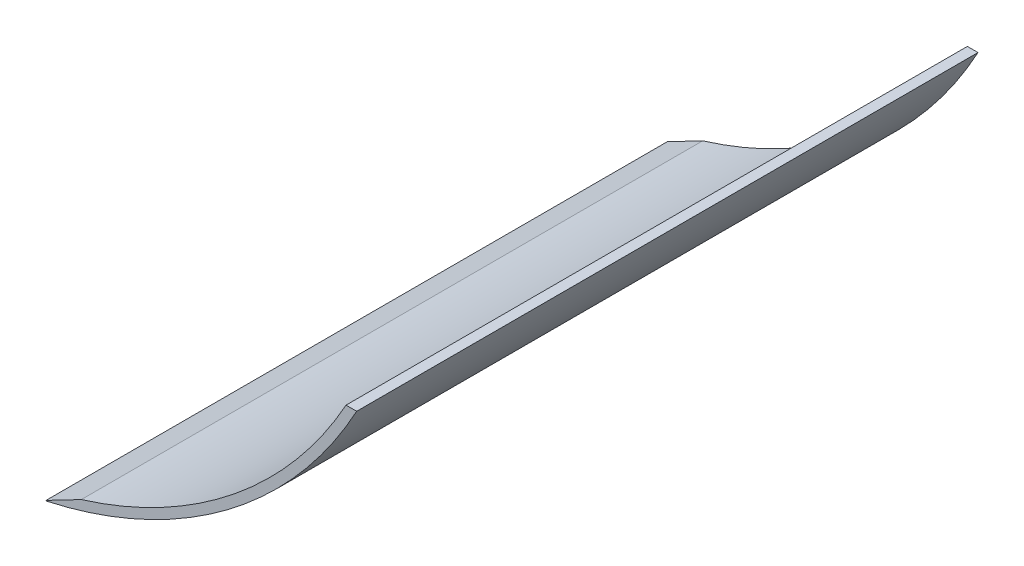
ISO-10303-21;
HEADER;
FILE_DESCRIPTION(('STEP AP214'),'2;1');
FILE_NAME('part.step','',(''),(''),'','','');
FILE_SCHEMA(('AUTOMOTIVE_DESIGN { 1 0 10303 214 1 1 1 1 }'));
ENDSEC;
DATA;
#1=APPLICATION_CONTEXT('core data for automotive mechanical design processes');
#2=APPLICATION_PROTOCOL_DEFINITION('international standard','automotive_design',2000,#1);
#3=PRODUCT_CONTEXT('',#1,'mechanical');
#4=PRODUCT('Part','Part','',(#3));
#5=PRODUCT_RELATED_PRODUCT_CATEGORY('part','',(#4));
#6=PRODUCT_DEFINITION_FORMATION('','',#4);
#7=PRODUCT_DEFINITION_CONTEXT('part definition',#1,'design');
#8=PRODUCT_DEFINITION('design','',#6,#7);
#9=PRODUCT_DEFINITION_SHAPE('','',#8);
#10=(LENGTH_UNIT() NAMED_UNIT(*) SI_UNIT(.MILLI.,.METRE.));
#11=(NAMED_UNIT(*) PLANE_ANGLE_UNIT() SI_UNIT($,.RADIAN.));
#12=(NAMED_UNIT(*) SI_UNIT($,.STERADIAN.) SOLID_ANGLE_UNIT());
#13=UNCERTAINTY_MEASURE_WITH_UNIT(LENGTH_MEASURE(1.E-05),#10,'distance_accuracy_value','');
#14=(GEOMETRIC_REPRESENTATION_CONTEXT(3) GLOBAL_UNCERTAINTY_ASSIGNED_CONTEXT((#13)) GLOBAL_UNIT_ASSIGNED_CONTEXT((#10,
#11,#12)) REPRESENTATION_CONTEXT('',''));
#15=CARTESIAN_POINT('',(0.,0.,0.));
#16=DIRECTION('',(0.,0.,1.));
#17=DIRECTION('',(1.,0.,0.));
#18=AXIS2_PLACEMENT_3D('',#15,#16,#17);
#19=CARTESIAN_POINT('',(-31.8153408597679,146.587121146357,200.));
#20=DIRECTION('',(0.,0.,-1.));
#21=DIRECTION('',(-1.,0.,0.));
#22=AXIS2_PLACEMENT_3D('',#19,#20,#21);
#23=CYLINDRICAL_SURFACE('',#22,150.);
#24=CARTESIAN_POINT('',(-31.8153408597679,146.587121146357,0.));
#25=DIRECTION('',(0.,0.,1.));
#26=DIRECTION('',(1.,0.,0.));
#27=AXIS2_PLACEMENT_3D('',#24,#25,#26);
#28=CIRCLE('',#27,150.);
#29=CARTESIAN_POINT('',(0.,0.,0.));
#30=VERTEX_POINT('',#29);
#31=CARTESIAN_POINT('',(100.,75.,0.));
#32=VERTEX_POINT('',#31);
#33=EDGE_CURVE('E114',#30,#32,#28,.T.);
#34=ORIENTED_EDGE('',*,*,#33,.T.);
#35=DIRECTION('',(0.,0.,-1.));
#36=VECTOR('',#35,1.);
#37=CARTESIAN_POINT('',(100.,75.,200.));
#38=LINE('',#37,#36);
#39=CARTESIAN_POINT('',(100.,75.,200.));
#40=VERTEX_POINT('',#39);
#41=EDGE_CURVE('E94',#40,#32,#38,.T.);
#42=ORIENTED_EDGE('',*,*,#41,.F.);
#43=CARTESIAN_POINT('',(-31.8153408597679,146.587121146357,200.));
#44=DIRECTION('',(0.,0.,1.));
#45=DIRECTION('',(1.,0.,0.));
#46=AXIS2_PLACEMENT_3D('',#43,#44,#45);
#47=CIRCLE('',#46,150.);
#48=CARTESIAN_POINT('',(0.,0.,200.));
#49=VERTEX_POINT('',#48);
#50=EDGE_CURVE('E101',#49,#40,#47,.T.);
#51=ORIENTED_EDGE('',*,*,#50,.F.);
#52=DIRECTION('',(0.,0.,-1.));
#53=VECTOR('',#52,1.);
#54=CARTESIAN_POINT('',(0.,0.,200.));
#55=LINE('',#54,#53);
#56=EDGE_CURVE('E122',#49,#30,#55,.T.);
#57=ORIENTED_EDGE('',*,*,#56,.T.);
#58=EDGE_LOOP('',(#34,#42,#51,#57));
#59=FACE_BOUND('',#58,.T.);
#60=ADVANCED_FACE('F41',(#59),#23,.T.);
#61=CARTESIAN_POINT('',(100.,75.,200.));
#62=DIRECTION('',(0.,-1.,0.));
#63=DIRECTION('',(0.,0.,-1.));
#64=AXIS2_PLACEMENT_3D('',#61,#62,#63);
#65=PLANE('',#64);
#66=DIRECTION('',(-1.,0.,0.));
#67=VECTOR('',#66,1.);
#68=CARTESIAN_POINT('',(100.,75.,0.));
#69=LINE('',#68,#67);
#70=CARTESIAN_POINT('',(96.5757962407999,75.,0.));
#71=VERTEX_POINT('',#70);
#72=EDGE_CURVE('E135',#32,#71,#69,.T.);
#73=ORIENTED_EDGE('',*,*,#72,.T.);
#74=DIRECTION('',(0.,0.,-1.));
#75=VECTOR('',#74,1.);
#76=CARTESIAN_POINT('',(96.5757962407999,75.,200.));
#77=LINE('',#76,#75);
#78=CARTESIAN_POINT('',(96.5757962407999,75.,200.));
#79=VERTEX_POINT('',#78);
#80=EDGE_CURVE('E97',#79,#71,#77,.T.);
#81=ORIENTED_EDGE('',*,*,#80,.F.);
#82=DIRECTION('',(-1.,0.,0.));
#83=VECTOR('',#82,1.);
#84=CARTESIAN_POINT('',(100.,75.,200.));
#85=LINE('',#84,#83);
#86=EDGE_CURVE('E90',#40,#79,#85,.T.);
#87=ORIENTED_EDGE('',*,*,#86,.F.);
#88=ORIENTED_EDGE('',*,*,#41,.T.);
#89=EDGE_LOOP('',(#73,#81,#87,#88));
#90=FACE_BOUND('',#89,.T.);
#91=ADVANCED_FACE('F92',(#90),#65,.F.);
#92=CARTESIAN_POINT('',(-31.8153408597679,146.587121146357,200.));
#93=DIRECTION('',(0.,0.,-1.));
#94=DIRECTION('',(-1.,0.,0.));
#95=AXIS2_PLACEMENT_3D('',#92,#93,#94);
#96=CYLINDRICAL_SURFACE('',#95,147.);
#97=CARTESIAN_POINT('',(-31.8153408597679,146.587121146357,0.));
#98=DIRECTION('',(0.,0.,-1.));
#99=DIRECTION('',(1.,0.,0.));
#100=AXIS2_PLACEMENT_3D('',#97,#98,#99);
#101=CIRCLE('',#100,147.);
#102=CARTESIAN_POINT('',(11.3770662722087,6.07585481462994,0.));
#103=VERTEX_POINT('',#102);
#104=EDGE_CURVE('E132',#71,#103,#101,.T.);
#105=ORIENTED_EDGE('',*,*,#104,.T.);
#106=DIRECTION('',(0.,0.,-1.));
#107=VECTOR('',#106,1.);
#108=CARTESIAN_POINT('',(11.3770662722087,6.07585481462994,200.));
#109=LINE('',#108,#107);
#110=CARTESIAN_POINT('',(11.3770662722087,6.07585481462994,200.));
#111=VERTEX_POINT('',#110);
#112=EDGE_CURVE('E51',#103,#111,#109,.F.);
#113=ORIENTED_EDGE('',*,*,#112,.T.);
#114=CARTESIAN_POINT('',(-31.8153408597679,146.587121146357,200.));
#115=DIRECTION('',(0.,0.,-1.));
#116=DIRECTION('',(1.,0.,0.));
#117=AXIS2_PLACEMENT_3D('',#114,#115,#116);
#118=CIRCLE('',#117,147.);
#119=EDGE_CURVE('E100',#79,#111,#118,.T.);
#120=ORIENTED_EDGE('',*,*,#119,.F.);
#121=ORIENTED_EDGE('',*,*,#80,.T.);
#122=EDGE_LOOP('',(#105,#113,#120,#121));
#123=FACE_BOUND('',#122,.T.);
#124=ADVANCED_FACE('F149',(#123),#96,.F.);
#125=CARTESIAN_POINT('',(0.,0.,200.));
#126=DIRECTION('',(1.,0.,0.));
#127=DIRECTION('',(0.,0.,-1.));
#128=AXIS2_PLACEMENT_3D('',#125,#126,#127);
#129=PLANE('',#128);
#130=DIRECTION('',(0.,-1.,0.));
#131=VECTOR('',#130,1.);
#132=CARTESIAN_POINT('',(0.,0.,200.));
#133=LINE('',#132,#131);
#134=CARTESIAN_POINT('',(0.,0.153458189840777,200.));
#135=VERTEX_POINT('',#134);
#136=EDGE_CURVE('E106',#135,#49,#133,.T.);
#137=ORIENTED_EDGE('',*,*,#136,.F.);
#138=DIRECTION('',(0.,0.,-1.));
#139=VECTOR('',#138,1.);
#140=CARTESIAN_POINT('',(0.,0.153458189840777,200.));
#141=LINE('',#140,#139);
#142=CARTESIAN_POINT('',(0.,0.153458189840777,0.));
#143=VERTEX_POINT('',#142);
#144=EDGE_CURVE('E116',#135,#143,#141,.T.);
#145=ORIENTED_EDGE('',*,*,#144,.T.);
#146=DIRECTION('',(0.,-1.,0.));
#147=VECTOR('',#146,1.);
#148=CARTESIAN_POINT('',(0.,0.,0.));
#149=LINE('',#148,#147);
#150=EDGE_CURVE('E111',#143,#30,#149,.T.);
#151=ORIENTED_EDGE('',*,*,#150,.T.);
#152=ORIENTED_EDGE('',*,*,#56,.F.);
#153=EDGE_LOOP('',(#137,#145,#151,#152));
#154=FACE_BOUND('',#153,.T.);
#155=ADVANCED_FACE('F147',(#154),#129,.F.);
#156=CARTESIAN_POINT('',(-31.8153408597679,146.587121146357,200.));
#157=DIRECTION('',(0.,0.,1.));
#158=DIRECTION('',(1.,0.,0.));
#159=AXIS2_PLACEMENT_3D('',#156,#157,#158);
#160=PLANE('',#159);
#161=ORIENTED_EDGE('',*,*,#119,.T.);
#162=DIRECTION('',(0.887014959113621,0.461740687300416,0.));
#163=VECTOR('',#162,1.);
#164=CARTESIAN_POINT('',(34.9427984500077,18.3431308743121,200.));
#165=LINE('',#164,#163);
#166=EDGE_CURVE('E11',#111,#135,#165,.F.);
#167=ORIENTED_EDGE('',*,*,#166,.T.);
#168=ORIENTED_EDGE('',*,*,#136,.T.);
#169=ORIENTED_EDGE('',*,*,#50,.T.);
#170=ORIENTED_EDGE('',*,*,#86,.T.);
#171=EDGE_LOOP('',(#161,#167,#168,#169,#170));
#172=FACE_BOUND('',#171,.T.);
#173=ADVANCED_FACE('F104',(#172),#160,.T.);
#174=CARTESIAN_POINT('',(-31.8153408597679,146.587121146357,0.));
#175=DIRECTION('',(0.,0.,1.));
#176=DIRECTION('',(1.,0.,0.));
#177=AXIS2_PLACEMENT_3D('',#174,#175,#176);
#178=PLANE('',#177);
#179=ORIENTED_EDGE('',*,*,#150,.F.);
#180=DIRECTION('',(-0.887014959113621,-0.461740687300416,0.));
#181=VECTOR('',#180,1.);
#182=CARTESIAN_POINT('',(0.,0.153458189840777,0.));
#183=LINE('',#182,#181);
#184=EDGE_CURVE('E65',#143,#103,#183,.F.);
#185=ORIENTED_EDGE('',*,*,#184,.T.);
#186=ORIENTED_EDGE('',*,*,#104,.F.);
#187=ORIENTED_EDGE('',*,*,#72,.F.);
#188=ORIENTED_EDGE('',*,*,#33,.F.);
#189=EDGE_LOOP('',(#179,#185,#186,#187,#188));
#190=FACE_BOUND('',#189,.T.);
#191=ADVANCED_FACE('F148',(#190),#178,.F.);
#192=CARTESIAN_POINT('',(0.,0.153458189840777,200.));
#193=DIRECTION('',(0.461740687300416,-0.887014959113621,0.));
#194=DIRECTION('',(0.,0.,-1.));
#195=AXIS2_PLACEMENT_3D('',#192,#193,#194);
#196=PLANE('',#195);
#197=ORIENTED_EDGE('',*,*,#166,.F.);
#198=ORIENTED_EDGE('',*,*,#112,.F.);
#199=ORIENTED_EDGE('',*,*,#184,.F.);
#200=ORIENTED_EDGE('',*,*,#144,.F.);
#201=EDGE_LOOP('',(#197,#198,#199,#200));
#202=FACE_BOUND('',#201,.T.);
#203=ADVANCED_FACE('F44',(#202),#196,.F.);
#204=CLOSED_SHELL('',(#60,#91,#124,#155,#173,#191,#203));
#205=MANIFOLD_SOLID_BREP('B2',#204);
#206=ADVANCED_BREP_SHAPE_REPRESENTATION('',(#18,#205),#14);
#207=SHAPE_DEFINITION_REPRESENTATION(#9,#206);
ENDSEC;
END-ISO-10303-21;
